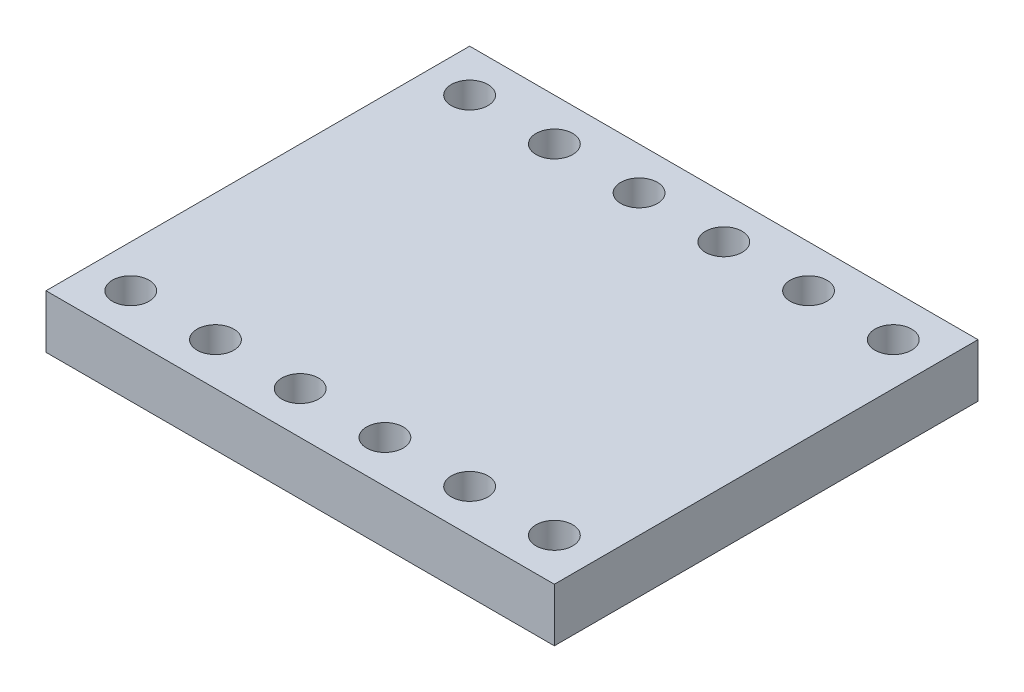
ISO-10303-21;
HEADER;
FILE_DESCRIPTION(('STEP AP214'),'2;1');
FILE_NAME('part.step','',(''),(''),'','','');
FILE_SCHEMA(('AUTOMOTIVE_DESIGN { 1 0 10303 214 1 1 1 1 }'));
ENDSEC;
DATA;
#1=APPLICATION_CONTEXT('core data for automotive mechanical design processes');
#2=APPLICATION_PROTOCOL_DEFINITION('international standard','automotive_design',2000,#1);
#3=PRODUCT_CONTEXT('',#1,'mechanical');
#4=PRODUCT('Part','Part','',(#3));
#5=PRODUCT_RELATED_PRODUCT_CATEGORY('part','',(#4));
#6=PRODUCT_DEFINITION_FORMATION('','',#4);
#7=PRODUCT_DEFINITION_CONTEXT('part definition',#1,'design');
#8=PRODUCT_DEFINITION('design','',#6,#7);
#9=PRODUCT_DEFINITION_SHAPE('','',#8);
#10=(LENGTH_UNIT() NAMED_UNIT(*) SI_UNIT(.MILLI.,.METRE.));
#11=(NAMED_UNIT(*) PLANE_ANGLE_UNIT() SI_UNIT($,.RADIAN.));
#12=(NAMED_UNIT(*) SI_UNIT($,.STERADIAN.) SOLID_ANGLE_UNIT());
#13=UNCERTAINTY_MEASURE_WITH_UNIT(LENGTH_MEASURE(1.E-05),#10,'distance_accuracy_value','');
#14=(GEOMETRIC_REPRESENTATION_CONTEXT(3) GLOBAL_UNCERTAINTY_ASSIGNED_CONTEXT((#13)) GLOBAL_UNIT_ASSIGNED_CONTEXT((#10,
#11,#12)) REPRESENTATION_CONTEXT('',''));
#15=CARTESIAN_POINT('',(0.,0.,0.));
#16=DIRECTION('',(0.,0.,1.));
#17=DIRECTION('',(1.,0.,0.));
#18=AXIS2_PLACEMENT_3D('',#15,#16,#17);
#19=CARTESIAN_POINT('',(6.35,-0.8,-5.08));
#20=DIRECTION('',(0.,1.,0.));
#21=DIRECTION('',(0.,0.,1.));
#22=AXIS2_PLACEMENT_3D('',#19,#20,#21);
#23=CYLINDRICAL_SURFACE('',#22,0.55);
#24=CARTESIAN_POINT('',(6.35,-0.8,-5.08));
#25=DIRECTION('',(0.,1.,0.));
#26=DIRECTION('',(0.,0.,1.));
#27=AXIS2_PLACEMENT_3D('',#24,#25,#26);
#28=CIRCLE('',#27,0.55);
#29=CARTESIAN_POINT('',(6.35,-0.8,-4.53));
#30=VERTEX_POINT('',#29);
#31=EDGE_CURVE('E46',#30,#30,#28,.T.);
#32=ORIENTED_EDGE('',*,*,#31,.F.);
#33=EDGE_LOOP('',(#32));
#34=FACE_BOUND('',#33,.T.);
#35=CARTESIAN_POINT('',(6.35,0.8,-5.08));
#36=DIRECTION('',(0.,1.,0.));
#37=DIRECTION('',(0.,0.,1.));
#38=AXIS2_PLACEMENT_3D('',#35,#36,#37);
#39=CIRCLE('',#38,0.55);
#40=CARTESIAN_POINT('',(6.35,0.8,-4.53));
#41=VERTEX_POINT('',#40);
#42=EDGE_CURVE('E11',#41,#41,#39,.T.);
#43=ORIENTED_EDGE('',*,*,#42,.T.);
#44=EDGE_LOOP('',(#43));
#45=FACE_BOUND('',#44,.T.);
#46=ADVANCED_FACE('F37',(#34,#45),#23,.F.);
#47=CARTESIAN_POINT('',(3.81,-0.8,-5.08));
#48=DIRECTION('',(0.,1.,0.));
#49=DIRECTION('',(0.,0.,1.));
#50=AXIS2_PLACEMENT_3D('',#47,#48,#49);
#51=CYLINDRICAL_SURFACE('',#50,0.55);
#52=CARTESIAN_POINT('',(3.81,-0.8,-5.08));
#53=DIRECTION('',(0.,1.,0.));
#54=DIRECTION('',(0.,0.,1.));
#55=AXIS2_PLACEMENT_3D('',#52,#53,#54);
#56=CIRCLE('',#55,0.55);
#57=CARTESIAN_POINT('',(3.81,-0.8,-4.53));
#58=VERTEX_POINT('',#57);
#59=EDGE_CURVE('E191',#58,#58,#56,.T.);
#60=ORIENTED_EDGE('',*,*,#59,.F.);
#61=EDGE_LOOP('',(#60));
#62=FACE_BOUND('',#61,.T.);
#63=CARTESIAN_POINT('',(3.81,0.8,-5.08));
#64=DIRECTION('',(0.,1.,0.));
#65=DIRECTION('',(0.,0.,1.));
#66=AXIS2_PLACEMENT_3D('',#63,#64,#65);
#67=CIRCLE('',#66,0.55);
#68=CARTESIAN_POINT('',(3.81,0.8,-4.53));
#69=VERTEX_POINT('',#68);
#70=EDGE_CURVE('E195',#69,#69,#67,.T.);
#71=ORIENTED_EDGE('',*,*,#70,.T.);
#72=EDGE_LOOP('',(#71));
#73=FACE_BOUND('',#72,.T.);
#74=ADVANCED_FACE('F207',(#62,#73),#51,.F.);
#75=CARTESIAN_POINT('',(1.27,-0.8,-5.08));
#76=DIRECTION('',(0.,1.,0.));
#77=DIRECTION('',(0.,0.,1.));
#78=AXIS2_PLACEMENT_3D('',#75,#76,#77);
#79=CYLINDRICAL_SURFACE('',#78,0.55);
#80=CARTESIAN_POINT('',(1.27,-0.8,-5.08));
#81=DIRECTION('',(0.,1.,0.));
#82=DIRECTION('',(0.,0.,1.));
#83=AXIS2_PLACEMENT_3D('',#80,#81,#82);
#84=CIRCLE('',#83,0.55);
#85=CARTESIAN_POINT('',(1.27,-0.8,-4.53));
#86=VERTEX_POINT('',#85);
#87=EDGE_CURVE('E183',#86,#86,#84,.T.);
#88=ORIENTED_EDGE('',*,*,#87,.F.);
#89=EDGE_LOOP('',(#88));
#90=FACE_BOUND('',#89,.T.);
#91=CARTESIAN_POINT('',(1.27,0.8,-5.08));
#92=DIRECTION('',(0.,1.,0.));
#93=DIRECTION('',(0.,0.,1.));
#94=AXIS2_PLACEMENT_3D('',#91,#92,#93);
#95=CIRCLE('',#94,0.55);
#96=CARTESIAN_POINT('',(1.27,0.8,-4.53));
#97=VERTEX_POINT('',#96);
#98=EDGE_CURVE('E187',#97,#97,#95,.T.);
#99=ORIENTED_EDGE('',*,*,#98,.T.);
#100=EDGE_LOOP('',(#99));
#101=FACE_BOUND('',#100,.T.);
#102=ADVANCED_FACE('F262',(#90,#101),#79,.F.);
#103=CARTESIAN_POINT('',(-1.27,-0.8,-5.08));
#104=DIRECTION('',(0.,1.,0.));
#105=DIRECTION('',(0.,0.,1.));
#106=AXIS2_PLACEMENT_3D('',#103,#104,#105);
#107=CYLINDRICAL_SURFACE('',#106,0.55);
#108=CARTESIAN_POINT('',(-1.27,-0.8,-5.08));
#109=DIRECTION('',(0.,1.,0.));
#110=DIRECTION('',(0.,0.,1.));
#111=AXIS2_PLACEMENT_3D('',#108,#109,#110);
#112=CIRCLE('',#111,0.55);
#113=CARTESIAN_POINT('',(-1.27,-0.8,-4.53));
#114=VERTEX_POINT('',#113);
#115=EDGE_CURVE('E176',#114,#114,#112,.T.);
#116=ORIENTED_EDGE('',*,*,#115,.F.);
#117=EDGE_LOOP('',(#116));
#118=FACE_BOUND('',#117,.T.);
#119=CARTESIAN_POINT('',(-1.27,0.8,-5.08));
#120=DIRECTION('',(0.,1.,0.));
#121=DIRECTION('',(0.,0.,1.));
#122=AXIS2_PLACEMENT_3D('',#119,#120,#121);
#123=CIRCLE('',#122,0.55);
#124=CARTESIAN_POINT('',(-1.27,0.8,-4.53));
#125=VERTEX_POINT('',#124);
#126=EDGE_CURVE('E179',#125,#125,#123,.T.);
#127=ORIENTED_EDGE('',*,*,#126,.T.);
#128=EDGE_LOOP('',(#127));
#129=FACE_BOUND('',#128,.T.);
#130=ADVANCED_FACE('F258',(#118,#129),#107,.F.);
#131=CARTESIAN_POINT('',(-3.81,-0.8,-5.08));
#132=DIRECTION('',(0.,1.,0.));
#133=DIRECTION('',(0.,0.,1.));
#134=AXIS2_PLACEMENT_3D('',#131,#132,#133);
#135=CYLINDRICAL_SURFACE('',#134,0.55);
#136=CARTESIAN_POINT('',(-3.81,-0.8,-5.08));
#137=DIRECTION('',(0.,1.,0.));
#138=DIRECTION('',(0.,0.,1.));
#139=AXIS2_PLACEMENT_3D('',#136,#137,#138);
#140=CIRCLE('',#139,0.55);
#141=CARTESIAN_POINT('',(-3.81,-0.8,-4.53));
#142=VERTEX_POINT('',#141);
#143=EDGE_CURVE('E168',#142,#142,#140,.T.);
#144=ORIENTED_EDGE('',*,*,#143,.F.);
#145=EDGE_LOOP('',(#144));
#146=FACE_BOUND('',#145,.T.);
#147=CARTESIAN_POINT('',(-3.81,0.8,-5.08));
#148=DIRECTION('',(0.,1.,0.));
#149=DIRECTION('',(0.,0.,1.));
#150=AXIS2_PLACEMENT_3D('',#147,#148,#149);
#151=CIRCLE('',#150,0.55);
#152=CARTESIAN_POINT('',(-3.81,0.8,-4.53));
#153=VERTEX_POINT('',#152);
#154=EDGE_CURVE('E172',#153,#153,#151,.T.);
#155=ORIENTED_EDGE('',*,*,#154,.T.);
#156=EDGE_LOOP('',(#155));
#157=FACE_BOUND('',#156,.T.);
#158=ADVANCED_FACE('F254',(#146,#157),#135,.F.);
#159=CARTESIAN_POINT('',(-6.35,-0.8,-5.08));
#160=DIRECTION('',(0.,1.,0.));
#161=DIRECTION('',(0.,0.,1.));
#162=AXIS2_PLACEMENT_3D('',#159,#160,#161);
#163=CYLINDRICAL_SURFACE('',#162,0.55);
#164=CARTESIAN_POINT('',(-6.35,-0.8,-5.08));
#165=DIRECTION('',(0.,1.,0.));
#166=DIRECTION('',(0.,0.,1.));
#167=AXIS2_PLACEMENT_3D('',#164,#165,#166);
#168=CIRCLE('',#167,0.55);
#169=CARTESIAN_POINT('',(-6.35,-0.8,-4.53));
#170=VERTEX_POINT('',#169);
#171=EDGE_CURVE('E160',#170,#170,#168,.T.);
#172=ORIENTED_EDGE('',*,*,#171,.F.);
#173=EDGE_LOOP('',(#172));
#174=FACE_BOUND('',#173,.T.);
#175=CARTESIAN_POINT('',(-6.35,0.8,-5.08));
#176=DIRECTION('',(0.,1.,0.));
#177=DIRECTION('',(0.,0.,1.));
#178=AXIS2_PLACEMENT_3D('',#175,#176,#177);
#179=CIRCLE('',#178,0.55);
#180=CARTESIAN_POINT('',(-6.35,0.8,-4.53));
#181=VERTEX_POINT('',#180);
#182=EDGE_CURVE('E164',#181,#181,#179,.T.);
#183=ORIENTED_EDGE('',*,*,#182,.T.);
#184=EDGE_LOOP('',(#183));
#185=FACE_BOUND('',#184,.T.);
#186=ADVANCED_FACE('F250',(#174,#185),#163,.F.);
#187=CARTESIAN_POINT('',(6.35,-0.8,5.08));
#188=DIRECTION('',(0.,1.,0.));
#189=DIRECTION('',(0.,0.,1.));
#190=AXIS2_PLACEMENT_3D('',#187,#188,#189);
#191=CYLINDRICAL_SURFACE('',#190,0.55);
#192=CARTESIAN_POINT('',(6.35,-0.8,5.08));
#193=DIRECTION('',(0.,1.,0.));
#194=DIRECTION('',(0.,0.,1.));
#195=AXIS2_PLACEMENT_3D('',#192,#193,#194);
#196=CIRCLE('',#195,0.55);
#197=CARTESIAN_POINT('',(6.35,-0.8,5.63));
#198=VERTEX_POINT('',#197);
#199=EDGE_CURVE('E152',#198,#198,#196,.T.);
#200=ORIENTED_EDGE('',*,*,#199,.F.);
#201=EDGE_LOOP('',(#200));
#202=FACE_BOUND('',#201,.T.);
#203=CARTESIAN_POINT('',(6.35,0.8,5.08));
#204=DIRECTION('',(0.,1.,0.));
#205=DIRECTION('',(0.,0.,1.));
#206=AXIS2_PLACEMENT_3D('',#203,#204,#205);
#207=CIRCLE('',#206,0.55);
#208=CARTESIAN_POINT('',(6.35,0.8,5.63));
#209=VERTEX_POINT('',#208);
#210=EDGE_CURVE('E156',#209,#209,#207,.T.);
#211=ORIENTED_EDGE('',*,*,#210,.T.);
#212=EDGE_LOOP('',(#211));
#213=FACE_BOUND('',#212,.T.);
#214=ADVANCED_FACE('F246',(#202,#213),#191,.F.);
#215=CARTESIAN_POINT('',(3.81,-0.8,5.08));
#216=DIRECTION('',(0.,1.,0.));
#217=DIRECTION('',(0.,0.,1.));
#218=AXIS2_PLACEMENT_3D('',#215,#216,#217);
#219=CYLINDRICAL_SURFACE('',#218,0.55);
#220=CARTESIAN_POINT('',(3.81,-0.8,5.08));
#221=DIRECTION('',(0.,1.,0.));
#222=DIRECTION('',(0.,0.,1.));
#223=AXIS2_PLACEMENT_3D('',#220,#221,#222);
#224=CIRCLE('',#223,0.55);
#225=CARTESIAN_POINT('',(3.81,-0.8,5.63));
#226=VERTEX_POINT('',#225);
#227=EDGE_CURVE('E144',#226,#226,#224,.T.);
#228=ORIENTED_EDGE('',*,*,#227,.F.);
#229=EDGE_LOOP('',(#228));
#230=FACE_BOUND('',#229,.T.);
#231=CARTESIAN_POINT('',(3.81,0.8,5.08));
#232=DIRECTION('',(0.,1.,0.));
#233=DIRECTION('',(0.,0.,1.));
#234=AXIS2_PLACEMENT_3D('',#231,#232,#233);
#235=CIRCLE('',#234,0.55);
#236=CARTESIAN_POINT('',(3.81,0.8,5.63));
#237=VERTEX_POINT('',#236);
#238=EDGE_CURVE('E148',#237,#237,#235,.T.);
#239=ORIENTED_EDGE('',*,*,#238,.T.);
#240=EDGE_LOOP('',(#239));
#241=FACE_BOUND('',#240,.T.);
#242=ADVANCED_FACE('F242',(#230,#241),#219,.F.);
#243=CARTESIAN_POINT('',(1.27,-0.8,5.08));
#244=DIRECTION('',(0.,1.,0.));
#245=DIRECTION('',(0.,0.,1.));
#246=AXIS2_PLACEMENT_3D('',#243,#244,#245);
#247=CYLINDRICAL_SURFACE('',#246,0.55);
#248=CARTESIAN_POINT('',(1.27,-0.8,5.08));
#249=DIRECTION('',(0.,1.,0.));
#250=DIRECTION('',(0.,0.,1.));
#251=AXIS2_PLACEMENT_3D('',#248,#249,#250);
#252=CIRCLE('',#251,0.55);
#253=CARTESIAN_POINT('',(1.27,-0.8,5.63));
#254=VERTEX_POINT('',#253);
#255=EDGE_CURVE('E136',#254,#254,#252,.T.);
#256=ORIENTED_EDGE('',*,*,#255,.F.);
#257=EDGE_LOOP('',(#256));
#258=FACE_BOUND('',#257,.T.);
#259=CARTESIAN_POINT('',(1.27,0.8,5.08));
#260=DIRECTION('',(0.,1.,0.));
#261=DIRECTION('',(0.,0.,1.));
#262=AXIS2_PLACEMENT_3D('',#259,#260,#261);
#263=CIRCLE('',#262,0.55);
#264=CARTESIAN_POINT('',(1.27,0.8,5.63));
#265=VERTEX_POINT('',#264);
#266=EDGE_CURVE('E140',#265,#265,#263,.T.);
#267=ORIENTED_EDGE('',*,*,#266,.T.);
#268=EDGE_LOOP('',(#267));
#269=FACE_BOUND('',#268,.T.);
#270=ADVANCED_FACE('F238',(#258,#269),#247,.F.);
#271=CARTESIAN_POINT('',(-1.27,-0.8,5.08));
#272=DIRECTION('',(0.,1.,0.));
#273=DIRECTION('',(0.,0.,1.));
#274=AXIS2_PLACEMENT_3D('',#271,#272,#273);
#275=CYLINDRICAL_SURFACE('',#274,0.55);
#276=CARTESIAN_POINT('',(-1.27,-0.8,5.08));
#277=DIRECTION('',(0.,1.,0.));
#278=DIRECTION('',(0.,0.,1.));
#279=AXIS2_PLACEMENT_3D('',#276,#277,#278);
#280=CIRCLE('',#279,0.55);
#281=CARTESIAN_POINT('',(-1.27,-0.8,5.63));
#282=VERTEX_POINT('',#281);
#283=EDGE_CURVE('E128',#282,#282,#280,.T.);
#284=ORIENTED_EDGE('',*,*,#283,.F.);
#285=EDGE_LOOP('',(#284));
#286=FACE_BOUND('',#285,.T.);
#287=CARTESIAN_POINT('',(-1.27,0.8,5.08));
#288=DIRECTION('',(0.,1.,0.));
#289=DIRECTION('',(0.,0.,1.));
#290=AXIS2_PLACEMENT_3D('',#287,#288,#289);
#291=CIRCLE('',#290,0.55);
#292=CARTESIAN_POINT('',(-1.27,0.8,5.63));
#293=VERTEX_POINT('',#292);
#294=EDGE_CURVE('E132',#293,#293,#291,.T.);
#295=ORIENTED_EDGE('',*,*,#294,.T.);
#296=EDGE_LOOP('',(#295));
#297=FACE_BOUND('',#296,.T.);
#298=ADVANCED_FACE('F234',(#286,#297),#275,.F.);
#299=CARTESIAN_POINT('',(-7.62,0.8,6.35));
#300=DIRECTION('',(1.,0.,0.));
#301=DIRECTION('',(0.,0.,-1.));
#302=AXIS2_PLACEMENT_3D('',#299,#300,#301);
#303=PLANE('',#302);
#304=DIRECTION('',(0.,0.,1.));
#305=VECTOR('',#304,1.);
#306=CARTESIAN_POINT('',(-7.62,-0.8,6.35));
#307=LINE('',#306,#305);
#308=CARTESIAN_POINT('',(-7.62,-0.8,-6.35));
#309=VERTEX_POINT('',#308);
#310=CARTESIAN_POINT('',(-7.62,-0.8,6.35));
#311=VERTEX_POINT('',#310);
#312=EDGE_CURVE('E112',#309,#311,#307,.T.);
#313=ORIENTED_EDGE('',*,*,#312,.T.);
#314=DIRECTION('',(0.,-1.,0.));
#315=VECTOR('',#314,1.);
#316=CARTESIAN_POINT('',(-7.62,0.8,6.35));
#317=LINE('',#316,#315);
#318=CARTESIAN_POINT('',(-7.62,0.8,6.35));
#319=VERTEX_POINT('',#318);
#320=EDGE_CURVE('E99',#319,#311,#317,.T.);
#321=ORIENTED_EDGE('',*,*,#320,.F.);
#322=DIRECTION('',(0.,0.,1.));
#323=VECTOR('',#322,1.);
#324=CARTESIAN_POINT('',(-7.62,0.8,6.35));
#325=LINE('',#324,#323);
#326=CARTESIAN_POINT('',(-7.62,0.8,-6.35));
#327=VERTEX_POINT('',#326);
#328=EDGE_CURVE('E91',#327,#319,#325,.T.);
#329=ORIENTED_EDGE('',*,*,#328,.F.);
#330=DIRECTION('',(0.,-1.,0.));
#331=VECTOR('',#330,1.);
#332=CARTESIAN_POINT('',(-7.62,0.8,-6.35));
#333=LINE('',#332,#331);
#334=EDGE_CURVE('E108',#327,#309,#333,.T.);
#335=ORIENTED_EDGE('',*,*,#334,.T.);
#336=EDGE_LOOP('',(#313,#321,#329,#335));
#337=FACE_BOUND('',#336,.T.);
#338=ADVANCED_FACE('F231',(#337),#303,.F.);
#339=CARTESIAN_POINT('',(7.62,0.8,6.35));
#340=DIRECTION('',(0.,0.,-1.));
#341=DIRECTION('',(-1.,0.,0.));
#342=AXIS2_PLACEMENT_3D('',#339,#340,#341);
#343=PLANE('',#342);
#344=DIRECTION('',(1.,0.,0.));
#345=VECTOR('',#344,1.);
#346=CARTESIAN_POINT('',(7.62,-0.8,6.35));
#347=LINE('',#346,#345);
#348=CARTESIAN_POINT('',(7.62,-0.8,6.35));
#349=VERTEX_POINT('',#348);
#350=EDGE_CURVE('E97',#311,#349,#347,.T.);
#351=ORIENTED_EDGE('',*,*,#350,.T.);
#352=DIRECTION('',(0.,-1.,0.));
#353=VECTOR('',#352,1.);
#354=CARTESIAN_POINT('',(7.62,0.8,6.35));
#355=LINE('',#354,#353);
#356=CARTESIAN_POINT('',(7.62,0.8,6.35));
#357=VERTEX_POINT('',#356);
#358=EDGE_CURVE('E95',#357,#349,#355,.T.);
#359=ORIENTED_EDGE('',*,*,#358,.F.);
#360=DIRECTION('',(1.,0.,0.));
#361=VECTOR('',#360,1.);
#362=CARTESIAN_POINT('',(7.62,0.8,6.35));
#363=LINE('',#362,#361);
#364=EDGE_CURVE('E85',#319,#357,#363,.T.);
#365=ORIENTED_EDGE('',*,*,#364,.F.);
#366=ORIENTED_EDGE('',*,*,#320,.T.);
#367=EDGE_LOOP('',(#351,#359,#365,#366));
#368=FACE_BOUND('',#367,.T.);
#369=ADVANCED_FACE('F96',(#368),#343,.F.);
#370=CARTESIAN_POINT('',(7.62,0.8,6.35));
#371=DIRECTION('',(-1.,0.,0.));
#372=DIRECTION('',(0.,0.,1.));
#373=AXIS2_PLACEMENT_3D('',#370,#371,#372);
#374=PLANE('',#373);
#375=DIRECTION('',(0.,0.,-1.));
#376=VECTOR('',#375,1.);
#377=CARTESIAN_POINT('',(7.62,-0.8,6.35));
#378=LINE('',#377,#376);
#379=CARTESIAN_POINT('',(7.62,-0.8,-6.35));
#380=VERTEX_POINT('',#379);
#381=EDGE_CURVE('E71',#349,#380,#378,.T.);
#382=ORIENTED_EDGE('',*,*,#381,.T.);
#383=DIRECTION('',(0.,-1.,0.));
#384=VECTOR('',#383,1.);
#385=CARTESIAN_POINT('',(7.62,0.8,-6.35));
#386=LINE('',#385,#384);
#387=CARTESIAN_POINT('',(7.62,0.8,-6.35));
#388=VERTEX_POINT('',#387);
#389=EDGE_CURVE('E100',#388,#380,#386,.T.);
#390=ORIENTED_EDGE('',*,*,#389,.F.);
#391=DIRECTION('',(0.,0.,-1.));
#392=VECTOR('',#391,1.);
#393=CARTESIAN_POINT('',(7.62,0.8,6.35));
#394=LINE('',#393,#392);
#395=EDGE_CURVE('E89',#357,#388,#394,.T.);
#396=ORIENTED_EDGE('',*,*,#395,.F.);
#397=ORIENTED_EDGE('',*,*,#358,.T.);
#398=EDGE_LOOP('',(#382,#390,#396,#397));
#399=FACE_BOUND('',#398,.T.);
#400=ADVANCED_FACE('F102',(#399),#374,.F.);
#401=CARTESIAN_POINT('',(7.62,0.8,-6.35));
#402=DIRECTION('',(0.,0.,1.));
#403=DIRECTION('',(1.,0.,0.));
#404=AXIS2_PLACEMENT_3D('',#401,#402,#403);
#405=PLANE('',#404);
#406=DIRECTION('',(-1.,0.,0.));
#407=VECTOR('',#406,1.);
#408=CARTESIAN_POINT('',(7.62,-0.8,-6.35));
#409=LINE('',#408,#407);
#410=EDGE_CURVE('E77',#380,#309,#409,.T.);
#411=ORIENTED_EDGE('',*,*,#410,.T.);
#412=ORIENTED_EDGE('',*,*,#334,.F.);
#413=DIRECTION('',(-1.,0.,0.));
#414=VECTOR('',#413,1.);
#415=CARTESIAN_POINT('',(7.62,0.8,-6.35));
#416=LINE('',#415,#414);
#417=EDGE_CURVE('E54',#388,#327,#416,.T.);
#418=ORIENTED_EDGE('',*,*,#417,.F.);
#419=ORIENTED_EDGE('',*,*,#389,.T.);
#420=EDGE_LOOP('',(#411,#412,#418,#419));
#421=FACE_BOUND('',#420,.T.);
#422=ADVANCED_FACE('F211',(#421),#405,.F.);
#423=CARTESIAN_POINT('',(0.,0.8,0.));
#424=DIRECTION('',(0.,1.,0.));
#425=DIRECTION('',(0.,0.,1.));
#426=AXIS2_PLACEMENT_3D('',#423,#424,#425);
#427=PLANE('',#426);
#428=CARTESIAN_POINT('',(-3.81,0.8,5.08));
#429=DIRECTION('',(0.,1.,0.));
#430=DIRECTION('',(0.,0.,1.));
#431=AXIS2_PLACEMENT_3D('',#428,#429,#430);
#432=CIRCLE('',#431,0.55);
#433=CARTESIAN_POINT('',(-3.81,0.8,5.63));
#434=VERTEX_POINT('',#433);
#435=EDGE_CURVE('E407',#434,#434,#432,.T.);
#436=ORIENTED_EDGE('',*,*,#435,.F.);
#437=EDGE_LOOP('',(#436));
#438=FACE_BOUND('',#437,.T.);
#439=CARTESIAN_POINT('',(-6.35,0.8,5.08));
#440=DIRECTION('',(0.,1.,0.));
#441=DIRECTION('',(0.,0.,1.));
#442=AXIS2_PLACEMENT_3D('',#439,#440,#441);
#443=CIRCLE('',#442,0.55);
#444=CARTESIAN_POINT('',(-6.35,0.8,5.63));
#445=VERTEX_POINT('',#444);
#446=EDGE_CURVE('E409',#445,#445,#443,.T.);
#447=ORIENTED_EDGE('',*,*,#446,.F.);
#448=EDGE_LOOP('',(#447));
#449=FACE_BOUND('',#448,.T.);
#450=ORIENTED_EDGE('',*,*,#328,.T.);
#451=ORIENTED_EDGE('',*,*,#364,.T.);
#452=ORIENTED_EDGE('',*,*,#395,.T.);
#453=ORIENTED_EDGE('',*,*,#417,.T.);
#454=EDGE_LOOP('',(#450,#451,#452,#453));
#455=FACE_BOUND('',#454,.T.);
#456=ORIENTED_EDGE('',*,*,#294,.F.);
#457=EDGE_LOOP('',(#456));
#458=FACE_BOUND('',#457,.T.);
#459=ORIENTED_EDGE('',*,*,#266,.F.);
#460=EDGE_LOOP('',(#459));
#461=FACE_BOUND('',#460,.T.);
#462=ORIENTED_EDGE('',*,*,#238,.F.);
#463=EDGE_LOOP('',(#462));
#464=FACE_BOUND('',#463,.T.);
#465=ORIENTED_EDGE('',*,*,#210,.F.);
#466=EDGE_LOOP('',(#465));
#467=FACE_BOUND('',#466,.T.);
#468=ORIENTED_EDGE('',*,*,#182,.F.);
#469=EDGE_LOOP('',(#468));
#470=FACE_BOUND('',#469,.T.);
#471=ORIENTED_EDGE('',*,*,#154,.F.);
#472=EDGE_LOOP('',(#471));
#473=FACE_BOUND('',#472,.T.);
#474=ORIENTED_EDGE('',*,*,#126,.F.);
#475=EDGE_LOOP('',(#474));
#476=FACE_BOUND('',#475,.T.);
#477=ORIENTED_EDGE('',*,*,#98,.F.);
#478=EDGE_LOOP('',(#477));
#479=FACE_BOUND('',#478,.T.);
#480=ORIENTED_EDGE('',*,*,#70,.F.);
#481=EDGE_LOOP('',(#480));
#482=FACE_BOUND('',#481,.T.);
#483=ORIENTED_EDGE('',*,*,#42,.F.);
#484=EDGE_LOOP('',(#483));
#485=FACE_BOUND('',#484,.T.);
#486=ADVANCED_FACE('F86',(#438,#449,#455,#458,#461,#464,#467,#470,#473,#476,#479,#482,#485),
#427,.T.);
#487=CARTESIAN_POINT('',(0.,-0.8,0.));
#488=DIRECTION('',(0.,1.,0.));
#489=DIRECTION('',(0.,0.,1.));
#490=AXIS2_PLACEMENT_3D('',#487,#488,#489);
#491=PLANE('',#490);
#492=CARTESIAN_POINT('',(-3.81,-0.8,5.08));
#493=DIRECTION('',(0.,1.,0.));
#494=DIRECTION('',(0.,0.,1.));
#495=AXIS2_PLACEMENT_3D('',#492,#493,#494);
#496=CIRCLE('',#495,0.55);
#497=CARTESIAN_POINT('',(-3.81,-0.8,5.63));
#498=VERTEX_POINT('',#497);
#499=EDGE_CURVE('E405',#498,#498,#496,.T.);
#500=ORIENTED_EDGE('',*,*,#499,.T.);
#501=EDGE_LOOP('',(#500));
#502=FACE_BOUND('',#501,.T.);
#503=CARTESIAN_POINT('',(-6.35,-0.8,5.08));
#504=DIRECTION('',(0.,1.,0.));
#505=DIRECTION('',(0.,0.,1.));
#506=AXIS2_PLACEMENT_3D('',#503,#504,#505);
#507=CIRCLE('',#506,0.55);
#508=CARTESIAN_POINT('',(-6.35,-0.8,5.63));
#509=VERTEX_POINT('',#508);
#510=EDGE_CURVE('E116',#509,#509,#507,.T.);
#511=ORIENTED_EDGE('',*,*,#510,.T.);
#512=EDGE_LOOP('',(#511));
#513=FACE_BOUND('',#512,.T.);
#514=ORIENTED_EDGE('',*,*,#312,.F.);
#515=ORIENTED_EDGE('',*,*,#410,.F.);
#516=ORIENTED_EDGE('',*,*,#381,.F.);
#517=ORIENTED_EDGE('',*,*,#350,.F.);
#518=EDGE_LOOP('',(#514,#515,#516,#517));
#519=FACE_BOUND('',#518,.T.);
#520=ORIENTED_EDGE('',*,*,#283,.T.);
#521=EDGE_LOOP('',(#520));
#522=FACE_BOUND('',#521,.T.);
#523=ORIENTED_EDGE('',*,*,#255,.T.);
#524=EDGE_LOOP('',(#523));
#525=FACE_BOUND('',#524,.T.);
#526=ORIENTED_EDGE('',*,*,#227,.T.);
#527=EDGE_LOOP('',(#526));
#528=FACE_BOUND('',#527,.T.);
#529=ORIENTED_EDGE('',*,*,#199,.T.);
#530=EDGE_LOOP('',(#529));
#531=FACE_BOUND('',#530,.T.);
#532=ORIENTED_EDGE('',*,*,#171,.T.);
#533=EDGE_LOOP('',(#532));
#534=FACE_BOUND('',#533,.T.);
#535=ORIENTED_EDGE('',*,*,#143,.T.);
#536=EDGE_LOOP('',(#535));
#537=FACE_BOUND('',#536,.T.);
#538=ORIENTED_EDGE('',*,*,#115,.T.);
#539=EDGE_LOOP('',(#538));
#540=FACE_BOUND('',#539,.T.);
#541=ORIENTED_EDGE('',*,*,#87,.T.);
#542=EDGE_LOOP('',(#541));
#543=FACE_BOUND('',#542,.T.);
#544=ORIENTED_EDGE('',*,*,#59,.T.);
#545=EDGE_LOOP('',(#544));
#546=FACE_BOUND('',#545,.T.);
#547=ORIENTED_EDGE('',*,*,#31,.T.);
#548=EDGE_LOOP('',(#547));
#549=FACE_BOUND('',#548,.T.);
#550=ADVANCED_FACE('F203',(#502,#513,#519,#522,#525,#528,#531,#534,#537,#540,#543,#546,#549),
#491,.F.);
#551=CARTESIAN_POINT('',(-6.35,-0.8,5.08));
#552=DIRECTION('',(0.,1.,0.));
#553=DIRECTION('',(0.,0.,1.));
#554=AXIS2_PLACEMENT_3D('',#551,#552,#553);
#555=CYLINDRICAL_SURFACE('',#554,0.55);
#556=ORIENTED_EDGE('',*,*,#510,.F.);
#557=EDGE_LOOP('',(#556));
#558=FACE_BOUND('',#557,.T.);
#559=ORIENTED_EDGE('',*,*,#446,.T.);
#560=EDGE_LOOP('',(#559));
#561=FACE_BOUND('',#560,.T.);
#562=ADVANCED_FACE('F218',(#558,#561),#555,.F.);
#563=CARTESIAN_POINT('',(-3.81,-0.8,5.08));
#564=DIRECTION('',(0.,1.,0.));
#565=DIRECTION('',(0.,0.,1.));
#566=AXIS2_PLACEMENT_3D('',#563,#564,#565);
#567=CYLINDRICAL_SURFACE('',#566,0.55);
#568=ORIENTED_EDGE('',*,*,#499,.F.);
#569=EDGE_LOOP('',(#568));
#570=FACE_BOUND('',#569,.T.);
#571=ORIENTED_EDGE('',*,*,#435,.T.);
#572=EDGE_LOOP('',(#571));
#573=FACE_BOUND('',#572,.T.);
#574=ADVANCED_FACE('F329',(#570,#573),#567,.F.);
#575=CLOSED_SHELL('',(#46,#74,#102,#130,#158,#186,#214,#242,#270,#298,#338,#369,#400,#422,#486,
#550,#562,#574));
#576=MANIFOLD_SOLID_BREP('B2',#575);
#577=ADVANCED_BREP_SHAPE_REPRESENTATION('',(#18,#576),#14);
#578=SHAPE_DEFINITION_REPRESENTATION(#9,#577);
ENDSEC;
END-ISO-10303-21;
